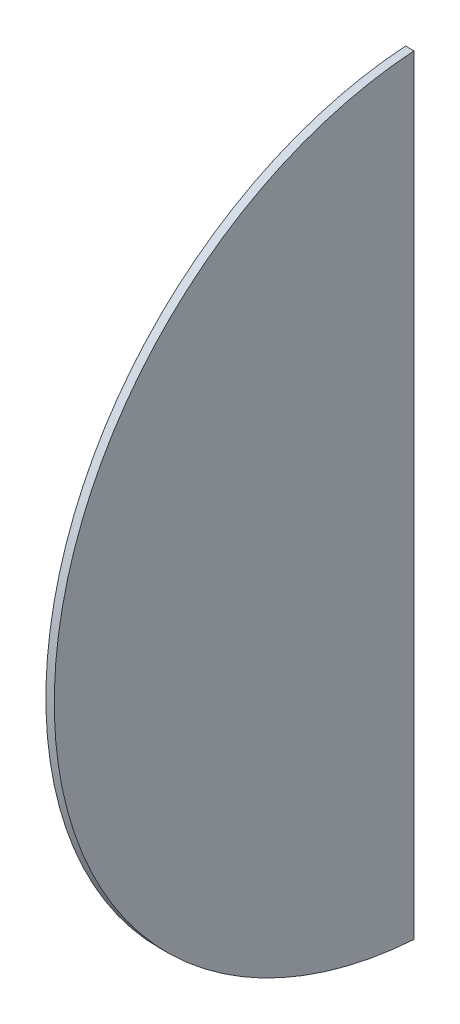
ISO-10303-21;
HEADER;
FILE_DESCRIPTION(('STEP AP214'),'2;1');
FILE_NAME('part.step','',(''),(''),'','','');
FILE_SCHEMA(('AUTOMOTIVE_DESIGN { 1 0 10303 214 1 1 1 1 }'));
ENDSEC;
DATA;
#1=APPLICATION_CONTEXT('core data for automotive mechanical design processes');
#2=APPLICATION_PROTOCOL_DEFINITION('international standard','automotive_design',2000,#1);
#3=PRODUCT_CONTEXT('',#1,'mechanical');
#4=PRODUCT('Part','Part','',(#3));
#5=PRODUCT_RELATED_PRODUCT_CATEGORY('part','',(#4));
#6=PRODUCT_DEFINITION_FORMATION('','',#4);
#7=PRODUCT_DEFINITION_CONTEXT('part definition',#1,'design');
#8=PRODUCT_DEFINITION('design','',#6,#7);
#9=PRODUCT_DEFINITION_SHAPE('','',#8);
#10=(LENGTH_UNIT() NAMED_UNIT(*) SI_UNIT(.MILLI.,.METRE.));
#11=(NAMED_UNIT(*) PLANE_ANGLE_UNIT() SI_UNIT($,.RADIAN.));
#12=(NAMED_UNIT(*) SI_UNIT($,.STERADIAN.) SOLID_ANGLE_UNIT());
#13=UNCERTAINTY_MEASURE_WITH_UNIT(LENGTH_MEASURE(1.E-05),#10,'distance_accuracy_value','');
#14=(GEOMETRIC_REPRESENTATION_CONTEXT(3) GLOBAL_UNCERTAINTY_ASSIGNED_CONTEXT((#13)) GLOBAL_UNIT_ASSIGNED_CONTEXT((#10,
#11,#12)) REPRESENTATION_CONTEXT('',''));
#15=CARTESIAN_POINT('',(0.,0.,0.));
#16=DIRECTION('',(0.,0.,1.));
#17=DIRECTION('',(1.,0.,0.));
#18=AXIS2_PLACEMENT_3D('',#15,#16,#17);
#19=CARTESIAN_POINT('',(10.,0.,-31.046511627907));
#20=DIRECTION('',(-1.,0.,0.));
#21=DIRECTION('',(0.,0.,1.));
#22=AXIS2_PLACEMENT_3D('',#19,#20,#21);
#23=CYLINDRICAL_SURFACE('',#22,461.046511627907);
#24=CARTESIAN_POINT('',(0.,0.,-31.046511627907));
#25=DIRECTION('',(1.,0.,0.));
#26=DIRECTION('',(0.,0.,1.));
#27=AXIS2_PLACEMENT_3D('',#24,#25,#26);
#28=CIRCLE('',#27,461.046511627907);
#29=CARTESIAN_POINT('',(0.,460.,1.69001258282335E-13));
#30=VERTEX_POINT('',#29);
#31=CARTESIAN_POINT('',(0.,-460.,0.));
#32=VERTEX_POINT('',#31);
#33=EDGE_CURVE('E70',#30,#32,#28,.T.);
#34=ORIENTED_EDGE('',*,*,#33,.T.);
#35=DIRECTION('',(-1.,0.,0.));
#36=VECTOR('',#35,1.);
#37=CARTESIAN_POINT('',(10.,-460.,0.));
#38=LINE('',#37,#36);
#39=CARTESIAN_POINT('',(10.,-460.,0.));
#40=VERTEX_POINT('',#39);
#41=EDGE_CURVE('E11',#40,#32,#38,.T.);
#42=ORIENTED_EDGE('',*,*,#41,.F.);
#43=CARTESIAN_POINT('',(10.,0.,-31.046511627907));
#44=DIRECTION('',(1.,0.,0.));
#45=DIRECTION('',(0.,0.,1.));
#46=AXIS2_PLACEMENT_3D('',#43,#44,#45);
#47=CIRCLE('',#46,461.046511627907);
#48=CARTESIAN_POINT('',(10.,460.,1.69001258282335E-13));
#49=VERTEX_POINT('',#48);
#50=EDGE_CURVE('E69',#49,#40,#47,.T.);
#51=ORIENTED_EDGE('',*,*,#50,.F.);
#52=DIRECTION('',(-1.,0.,0.));
#53=VECTOR('',#52,1.);
#54=CARTESIAN_POINT('',(10.,460.,1.69001258282335E-13));
#55=LINE('',#54,#53);
#56=EDGE_CURVE('E47',#49,#30,#55,.T.);
#57=ORIENTED_EDGE('',*,*,#56,.T.);
#58=EDGE_LOOP('',(#34,#42,#51,#57));
#59=FACE_BOUND('',#58,.T.);
#60=ADVANCED_FACE('F39',(#59),#23,.T.);
#61=CARTESIAN_POINT('',(10.,-460.,0.));
#62=DIRECTION('',(0.,0.,1.));
#63=DIRECTION('',(0.,-1.,0.));
#64=AXIS2_PLACEMENT_3D('',#61,#62,#63);
#65=PLANE('',#64);
#66=DIRECTION('',(0.,1.,0.));
#67=VECTOR('',#66,1.);
#68=CARTESIAN_POINT('',(0.,-460.,0.));
#69=LINE('',#68,#67);
#70=EDGE_CURVE('E62',#32,#30,#69,.T.);
#71=ORIENTED_EDGE('',*,*,#70,.T.);
#72=ORIENTED_EDGE('',*,*,#56,.F.);
#73=DIRECTION('',(0.,1.,0.));
#74=VECTOR('',#73,1.);
#75=CARTESIAN_POINT('',(10.,-460.,0.));
#76=LINE('',#75,#74);
#77=EDGE_CURVE('E54',#40,#49,#76,.T.);
#78=ORIENTED_EDGE('',*,*,#77,.F.);
#79=ORIENTED_EDGE('',*,*,#41,.T.);
#80=EDGE_LOOP('',(#71,#72,#78,#79));
#81=FACE_BOUND('',#80,.T.);
#82=ADVANCED_FACE('F65',(#81),#65,.F.);
#83=CARTESIAN_POINT('',(10.,0.,-31.046511627907));
#84=DIRECTION('',(-1.,0.,0.));
#85=DIRECTION('',(0.,0.,1.));
#86=AXIS2_PLACEMENT_3D('',#83,#84,#85);
#87=PLANE('',#86);
#88=ORIENTED_EDGE('',*,*,#50,.T.);
#89=ORIENTED_EDGE('',*,*,#77,.T.);
#90=EDGE_LOOP('',(#88,#89));
#91=FACE_BOUND('',#90,.T.);
#92=ADVANCED_FACE('F77',(#91),#87,.F.);
#93=CARTESIAN_POINT('',(0.,0.,-31.046511627907));
#94=DIRECTION('',(-1.,0.,0.));
#95=DIRECTION('',(0.,0.,1.));
#96=AXIS2_PLACEMENT_3D('',#93,#94,#95);
#97=PLANE('',#96);
#98=ORIENTED_EDGE('',*,*,#33,.F.);
#99=ORIENTED_EDGE('',*,*,#70,.F.);
#100=EDGE_LOOP('',(#98,#99));
#101=FACE_BOUND('',#100,.T.);
#102=ADVANCED_FACE('F73',(#101),#97,.T.);
#103=CLOSED_SHELL('',(#60,#82,#92,#102));
#104=MANIFOLD_SOLID_BREP('B2',#103);
#105=ADVANCED_BREP_SHAPE_REPRESENTATION('',(#18,#104),#14);
#106=SHAPE_DEFINITION_REPRESENTATION(#9,#105);
ENDSEC;
END-ISO-10303-21;
